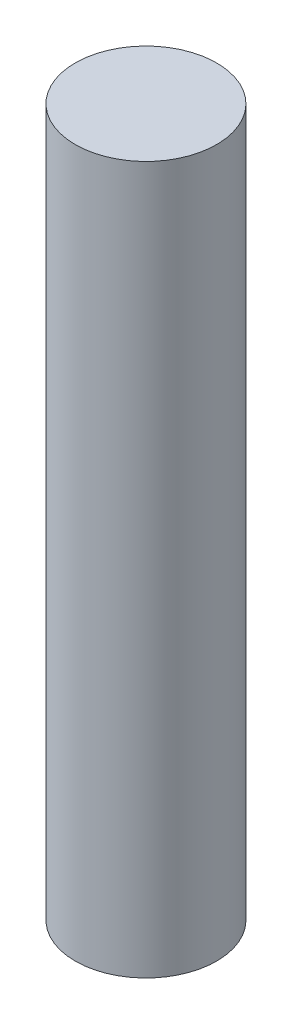
ISO-10303-21;
HEADER;
FILE_DESCRIPTION(('STEP AP214'),'2;1');
FILE_NAME('part.step','',(''),(''),'','','');
FILE_SCHEMA(('AUTOMOTIVE_DESIGN { 1 0 10303 214 1 1 1 1 }'));
ENDSEC;
DATA;
#1=APPLICATION_CONTEXT('core data for automotive mechanical design processes');
#2=APPLICATION_PROTOCOL_DEFINITION('international standard','automotive_design',2000,#1);
#3=PRODUCT_CONTEXT('',#1,'mechanical');
#4=PRODUCT('Part','Part','',(#3));
#5=PRODUCT_RELATED_PRODUCT_CATEGORY('part','',(#4));
#6=PRODUCT_DEFINITION_FORMATION('','',#4);
#7=PRODUCT_DEFINITION_CONTEXT('part definition',#1,'design');
#8=PRODUCT_DEFINITION('design','',#6,#7);
#9=PRODUCT_DEFINITION_SHAPE('','',#8);
#10=(LENGTH_UNIT() NAMED_UNIT(*) SI_UNIT(.MILLI.,.METRE.));
#11=(NAMED_UNIT(*) PLANE_ANGLE_UNIT() SI_UNIT($,.RADIAN.));
#12=(NAMED_UNIT(*) SI_UNIT($,.STERADIAN.) SOLID_ANGLE_UNIT());
#13=UNCERTAINTY_MEASURE_WITH_UNIT(LENGTH_MEASURE(1.E-05),#10,'distance_accuracy_value','');
#14=(GEOMETRIC_REPRESENTATION_CONTEXT(3) GLOBAL_UNCERTAINTY_ASSIGNED_CONTEXT((#13)) GLOBAL_UNIT_ASSIGNED_CONTEXT((#10,
#11,#12)) REPRESENTATION_CONTEXT('',''));
#15=CARTESIAN_POINT('',(0.,0.,0.));
#16=DIRECTION('',(0.,0.,1.));
#17=DIRECTION('',(1.,0.,0.));
#18=AXIS2_PLACEMENT_3D('',#15,#16,#17);
#19=CARTESIAN_POINT('',(0.,10.,0.));
#20=DIRECTION('',(0.,-1.,0.));
#21=DIRECTION('',(0.,0.,-1.));
#22=AXIS2_PLACEMENT_3D('',#19,#20,#21);
#23=CYLINDRICAL_SURFACE('',#22,1.);
#24=CARTESIAN_POINT('',(0.,10.,0.));
#25=DIRECTION('',(0.,1.,0.));
#26=DIRECTION('',(0.,0.,1.));
#27=AXIS2_PLACEMENT_3D('',#24,#25,#26);
#28=CIRCLE('',#27,1.);
#29=CARTESIAN_POINT('',(0.,10.,1.));
#30=VERTEX_POINT('',#29);
#31=EDGE_CURVE('E10',#30,#30,#28,.T.);
#32=ORIENTED_EDGE('',*,*,#31,.F.);
#33=EDGE_LOOP('',(#32));
#34=FACE_BOUND('',#33,.T.);
#35=CARTESIAN_POINT('',(0.,0.,0.));
#36=DIRECTION('',(0.,1.,0.));
#37=DIRECTION('',(0.,0.,1.));
#38=AXIS2_PLACEMENT_3D('',#35,#36,#37);
#39=CIRCLE('',#38,1.);
#40=CARTESIAN_POINT('',(0.,0.,1.));
#41=VERTEX_POINT('',#40);
#42=EDGE_CURVE('E40',#41,#41,#39,.T.);
#43=ORIENTED_EDGE('',*,*,#42,.T.);
#44=EDGE_LOOP('',(#43));
#45=FACE_BOUND('',#44,.T.);
#46=ADVANCED_FACE('F37',(#34,#45),#23,.T.);
#47=CARTESIAN_POINT('',(0.,10.,0.));
#48=DIRECTION('',(0.,1.,0.));
#49=DIRECTION('',(0.,0.,1.));
#50=AXIS2_PLACEMENT_3D('',#47,#48,#49);
#51=PLANE('',#50);
#52=ORIENTED_EDGE('',*,*,#31,.T.);
#53=EDGE_LOOP('',(#52));
#54=FACE_BOUND('',#53,.T.);
#55=ADVANCED_FACE('F54',(#54),#51,.T.);
#56=CARTESIAN_POINT('',(0.,0.,0.));
#57=DIRECTION('',(0.,1.,0.));
#58=DIRECTION('',(0.,0.,1.));
#59=AXIS2_PLACEMENT_3D('',#56,#57,#58);
#60=PLANE('',#59);
#61=ORIENTED_EDGE('',*,*,#42,.F.);
#62=EDGE_LOOP('',(#61));
#63=FACE_BOUND('',#62,.T.);
#64=ADVANCED_FACE('F52',(#63),#60,.F.);
#65=CLOSED_SHELL('',(#46,#55,#64));
#66=MANIFOLD_SOLID_BREP('B2',#65);
#67=ADVANCED_BREP_SHAPE_REPRESENTATION('',(#18,#66),#14);
#68=SHAPE_DEFINITION_REPRESENTATION(#9,#67);
ENDSEC;
END-ISO-10303-21;
